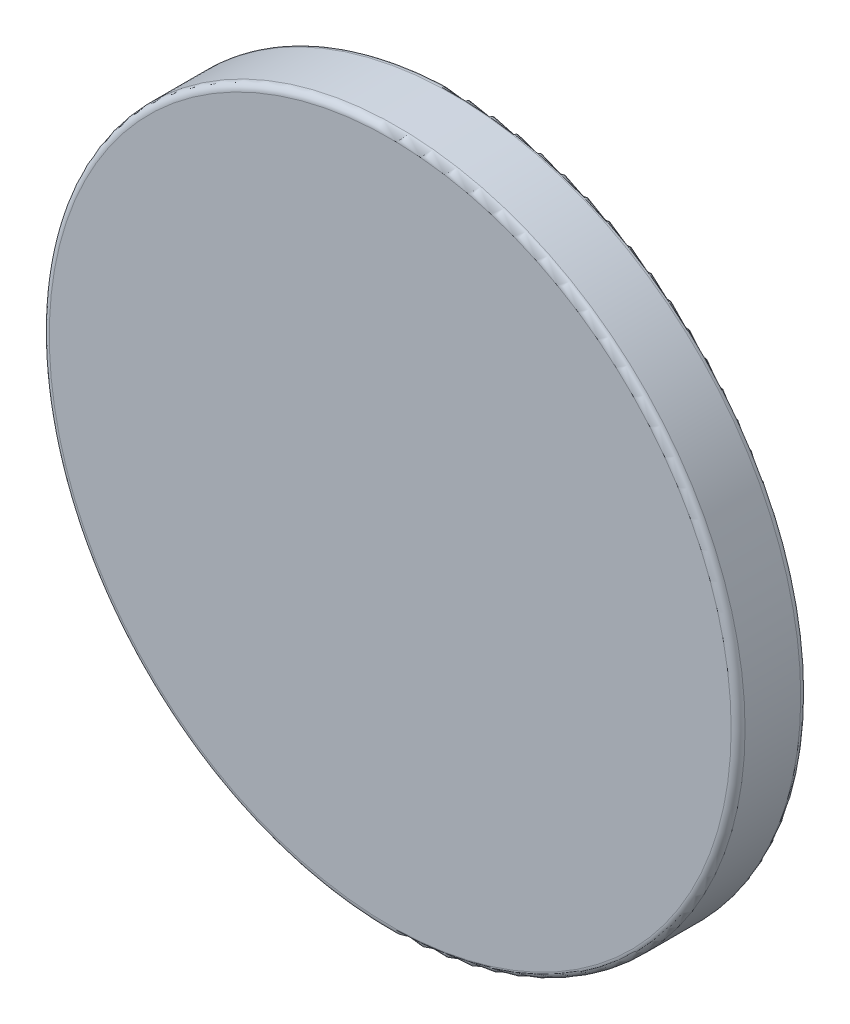
ISO-10303-21;
HEADER;
FILE_DESCRIPTION(('STEP AP214'),'2;1');
FILE_NAME('part.step','',(''),(''),'','','');
FILE_SCHEMA(('AUTOMOTIVE_DESIGN { 1 0 10303 214 1 1 1 1 }'));
ENDSEC;
DATA;
#1=APPLICATION_CONTEXT('core data for automotive mechanical design processes');
#2=APPLICATION_PROTOCOL_DEFINITION('international standard','automotive_design',2000,#1);
#3=PRODUCT_CONTEXT('',#1,'mechanical');
#4=PRODUCT('Part','Part','',(#3));
#5=PRODUCT_RELATED_PRODUCT_CATEGORY('part','',(#4));
#6=PRODUCT_DEFINITION_FORMATION('','',#4);
#7=PRODUCT_DEFINITION_CONTEXT('part definition',#1,'design');
#8=PRODUCT_DEFINITION('design','',#6,#7);
#9=PRODUCT_DEFINITION_SHAPE('','',#8);
#10=(LENGTH_UNIT() NAMED_UNIT(*) SI_UNIT(.MILLI.,.METRE.));
#11=(NAMED_UNIT(*) PLANE_ANGLE_UNIT() SI_UNIT($,.RADIAN.));
#12=(NAMED_UNIT(*) SI_UNIT($,.STERADIAN.) SOLID_ANGLE_UNIT());
#13=UNCERTAINTY_MEASURE_WITH_UNIT(LENGTH_MEASURE(1.E-05),#10,'distance_accuracy_value','');
#14=(GEOMETRIC_REPRESENTATION_CONTEXT(3) GLOBAL_UNCERTAINTY_ASSIGNED_CONTEXT((#13)) GLOBAL_UNIT_ASSIGNED_CONTEXT((#10,
#11,#12)) REPRESENTATION_CONTEXT('',''));
#15=CARTESIAN_POINT('',(0.,0.,0.));
#16=DIRECTION('',(0.,0.,1.));
#17=DIRECTION('',(1.,0.,0.));
#18=AXIS2_PLACEMENT_3D('',#15,#16,#17);
#19=CARTESIAN_POINT('',(0.,0.,10.));
#20=DIRECTION('',(0.,0.,-1.));
#21=DIRECTION('',(-1.,0.,0.));
#22=AXIS2_PLACEMENT_3D('',#19,#20,#21);
#23=CYLINDRICAL_SURFACE('',#22,50.);
#24=CARTESIAN_POINT('',(0.,0.,0.999999999999999));
#25=DIRECTION('',(0.,0.,1.));
#26=DIRECTION('',(1.,0.,0.));
#27=AXIS2_PLACEMENT_3D('',#24,#25,#26);
#28=CIRCLE('',#27,50.);
#29=CARTESIAN_POINT('',(50.,0.,0.999999999999999));
#30=VERTEX_POINT('',#29);
#31=EDGE_CURVE('E42',#30,#30,#28,.T.);
#32=ORIENTED_EDGE('',*,*,#31,.T.);
#33=EDGE_LOOP('',(#32));
#34=FACE_BOUND('',#33,.T.);
#35=CARTESIAN_POINT('',(0.,0.,9.));
#36=DIRECTION('',(0.,0.,1.));
#37=DIRECTION('',(1.,0.,0.));
#38=AXIS2_PLACEMENT_3D('',#35,#36,#37);
#39=CIRCLE('',#38,50.);
#40=CARTESIAN_POINT('',(50.,0.,9.));
#41=VERTEX_POINT('',#40);
#42=EDGE_CURVE('E46',#41,#41,#39,.F.);
#43=ORIENTED_EDGE('',*,*,#42,.T.);
#44=EDGE_LOOP('',(#43));
#45=FACE_BOUND('',#44,.T.);
#46=ADVANCED_FACE('F31',(#34,#45),#23,.T.);
#47=CARTESIAN_POINT('',(0.,0.,10.));
#48=DIRECTION('',(0.,0.,1.));
#49=DIRECTION('',(1.,0.,0.));
#50=AXIS2_PLACEMENT_3D('',#47,#48,#49);
#51=PLANE('',#50);
#52=CARTESIAN_POINT('',(0.,0.,10.));
#53=DIRECTION('',(0.,0.,1.));
#54=DIRECTION('',(1.,0.,0.));
#55=AXIS2_PLACEMENT_3D('',#52,#53,#54);
#56=CIRCLE('',#55,49.);
#57=CARTESIAN_POINT('',(49.,0.,10.));
#58=VERTEX_POINT('',#57);
#59=EDGE_CURVE('E10',#58,#58,#56,.T.);
#60=ORIENTED_EDGE('',*,*,#59,.T.);
#61=EDGE_LOOP('',(#60));
#62=FACE_BOUND('',#61,.T.);
#63=ADVANCED_FACE('F62',(#62),#51,.T.);
#64=CARTESIAN_POINT('',(0.,0.,0.));
#65=DIRECTION('',(0.,0.,1.));
#66=DIRECTION('',(1.,0.,0.));
#67=AXIS2_PLACEMENT_3D('',#64,#65,#66);
#68=PLANE('',#67);
#69=CARTESIAN_POINT('',(0.,0.,0.));
#70=DIRECTION('',(0.,0.,1.));
#71=DIRECTION('',(1.,0.,0.));
#72=AXIS2_PLACEMENT_3D('',#69,#70,#71);
#73=CIRCLE('',#72,49.);
#74=CARTESIAN_POINT('',(49.,0.,0.));
#75=VERTEX_POINT('',#74);
#76=EDGE_CURVE('E38',#75,#75,#73,.F.);
#77=ORIENTED_EDGE('',*,*,#76,.T.);
#78=EDGE_LOOP('',(#77));
#79=FACE_BOUND('',#78,.T.);
#80=ADVANCED_FACE('F59',(#79),#68,.F.);
#81=CARTESIAN_POINT('',(0.,0.,0.999999999999999));
#82=DIRECTION('',(0.,0.,1.));
#83=DIRECTION('',(1.,0.,0.));
#84=AXIS2_PLACEMENT_3D('',#81,#82,#83);
#85=TOROIDAL_SURFACE('',#84,49.,1.);
#86=ORIENTED_EDGE('',*,*,#76,.F.);
#87=EDGE_LOOP('',(#86));
#88=FACE_BOUND('',#87,.T.);
#89=ORIENTED_EDGE('',*,*,#31,.F.);
#90=EDGE_LOOP('',(#89));
#91=FACE_BOUND('',#90,.T.);
#92=ADVANCED_FACE('F55',(#88,#91),#85,.T.);
#93=CARTESIAN_POINT('',(0.,0.,9.));
#94=DIRECTION('',(0.,0.,1.));
#95=DIRECTION('',(1.,0.,0.));
#96=AXIS2_PLACEMENT_3D('',#93,#94,#95);
#97=TOROIDAL_SURFACE('',#96,49.,1.);
#98=ORIENTED_EDGE('',*,*,#42,.F.);
#99=EDGE_LOOP('',(#98));
#100=FACE_BOUND('',#99,.T.);
#101=ORIENTED_EDGE('',*,*,#59,.F.);
#102=EDGE_LOOP('',(#101));
#103=FACE_BOUND('',#102,.T.);
#104=ADVANCED_FACE('F33',(#100,#103),#97,.T.);
#105=CLOSED_SHELL('',(#46,#63,#80,#92,#104));
#106=MANIFOLD_SOLID_BREP('B2',#105);
#107=ADVANCED_BREP_SHAPE_REPRESENTATION('',(#18,#106),#14);
#108=SHAPE_DEFINITION_REPRESENTATION(#9,#107);
ENDSEC;
END-ISO-10303-21;
